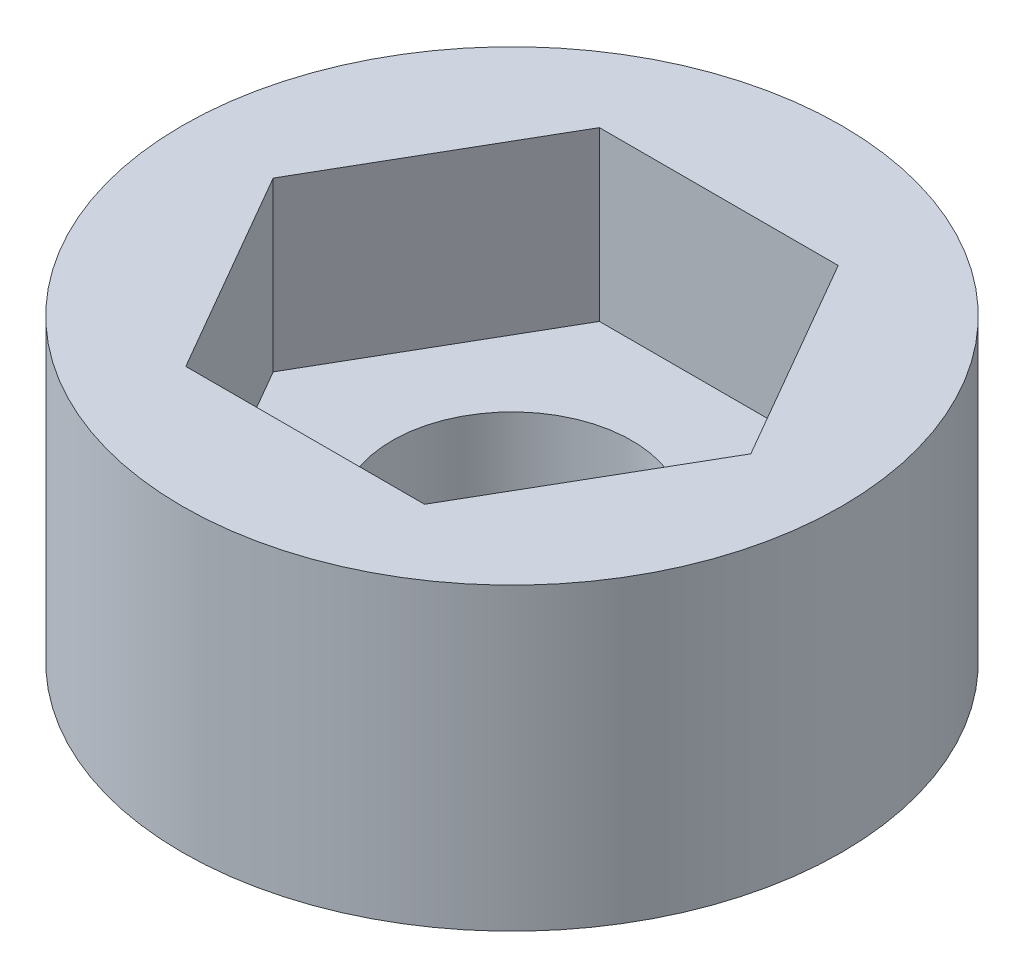
ISO-10303-21;
HEADER;
FILE_DESCRIPTION(('STEP AP214'),'2;1');
FILE_NAME('part.step','',(''),(''),'','','');
FILE_SCHEMA(('AUTOMOTIVE_DESIGN { 1 0 10303 214 1 1 1 1 }'));
ENDSEC;
DATA;
#1=APPLICATION_CONTEXT('core data for automotive mechanical design processes');
#2=APPLICATION_PROTOCOL_DEFINITION('international standard','automotive_design',2000,#1);
#3=PRODUCT_CONTEXT('',#1,'mechanical');
#4=PRODUCT('Part','Part','',(#3));
#5=PRODUCT_RELATED_PRODUCT_CATEGORY('part','',(#4));
#6=PRODUCT_DEFINITION_FORMATION('','',#4);
#7=PRODUCT_DEFINITION_CONTEXT('part definition',#1,'design');
#8=PRODUCT_DEFINITION('design','',#6,#7);
#9=PRODUCT_DEFINITION_SHAPE('','',#8);
#10=(LENGTH_UNIT() NAMED_UNIT(*) SI_UNIT(.MILLI.,.METRE.));
#11=(NAMED_UNIT(*) PLANE_ANGLE_UNIT() SI_UNIT($,.RADIAN.));
#12=(NAMED_UNIT(*) SI_UNIT($,.STERADIAN.) SOLID_ANGLE_UNIT());
#13=UNCERTAINTY_MEASURE_WITH_UNIT(LENGTH_MEASURE(1.E-05),#10,'distance_accuracy_value','');
#14=(GEOMETRIC_REPRESENTATION_CONTEXT(3) GLOBAL_UNCERTAINTY_ASSIGNED_CONTEXT((#13)) GLOBAL_UNIT_ASSIGNED_CONTEXT((#10,
#11,#12)) REPRESENTATION_CONTEXT('',''));
#15=CARTESIAN_POINT('',(0.,0.,0.));
#16=DIRECTION('',(0.,0.,1.));
#17=DIRECTION('',(1.,0.,0.));
#18=AXIS2_PLACEMENT_3D('',#15,#16,#17);
#19=CARTESIAN_POINT('',(0.,10.,0.));
#20=DIRECTION('',(0.,-1.,0.));
#21=DIRECTION('',(0.,0.,-1.));
#22=AXIS2_PLACEMENT_3D('',#19,#20,#21);
#23=CYLINDRICAL_SURFACE('',#22,4.);
#24=CARTESIAN_POINT('',(0.,0.,0.));
#25=DIRECTION('',(0.,1.,0.));
#26=DIRECTION('',(0.,0.,1.));
#27=AXIS2_PLACEMENT_3D('',#24,#25,#26);
#28=CIRCLE('',#27,4.);
#29=CARTESIAN_POINT('',(0.,0.,4.));
#30=VERTEX_POINT('',#29);
#31=EDGE_CURVE('E150',#30,#30,#28,.T.);
#32=ORIENTED_EDGE('',*,*,#31,.F.);
#33=EDGE_LOOP('',(#32));
#34=FACE_BOUND('',#33,.T.);
#35=CARTESIAN_POINT('',(0.,4.4,0.));
#36=DIRECTION('',(0.,1.,0.));
#37=DIRECTION('',(0.,0.,1.));
#38=AXIS2_PLACEMENT_3D('',#35,#36,#37);
#39=CIRCLE('',#38,4.);
#40=CARTESIAN_POINT('',(0.,4.4,4.));
#41=VERTEX_POINT('',#40);
#42=EDGE_CURVE('E45',#41,#41,#39,.T.);
#43=ORIENTED_EDGE('',*,*,#42,.T.);
#44=EDGE_LOOP('',(#43));
#45=FACE_BOUND('',#44,.T.);
#46=ADVANCED_FACE('F41',(#34,#45),#23,.F.);
#47=CARTESIAN_POINT('',(0.,10.,0.));
#48=DIRECTION('',(0.,1.,0.));
#49=DIRECTION('',(0.,0.,1.));
#50=AXIS2_PLACEMENT_3D('',#47,#48,#49);
#51=PLANE('',#50);
#52=DIRECTION('',(-0.5,0.,-0.866025403784439));
#53=VECTOR('',#52,1.);
#54=CARTESIAN_POINT('',(7.96743371481684,10.,0.));
#55=LINE('',#54,#53);
#56=CARTESIAN_POINT('',(7.96743371481684,10.,0.));
#57=VERTEX_POINT('',#56);
#58=CARTESIAN_POINT('',(3.98371685740842,10.,-6.9));
#59=VERTEX_POINT('',#58);
#60=EDGE_CURVE('E58',#57,#59,#55,.T.);
#61=ORIENTED_EDGE('',*,*,#60,.F.);
#62=DIRECTION('',(0.5,0.,-0.866025403784439));
#63=VECTOR('',#62,1.);
#64=CARTESIAN_POINT('',(3.98371685740842,10.,6.9));
#65=LINE('',#64,#63);
#66=CARTESIAN_POINT('',(3.98371685740842,10.,6.9));
#67=VERTEX_POINT('',#66);
#68=EDGE_CURVE('E141',#67,#57,#65,.T.);
#69=ORIENTED_EDGE('',*,*,#68,.F.);
#70=DIRECTION('',(1.,0.,0.));
#71=VECTOR('',#70,1.);
#72=CARTESIAN_POINT('',(-3.98371685740842,10.,6.9));
#73=LINE('',#72,#71);
#74=CARTESIAN_POINT('',(-3.98371685740842,10.,6.9));
#75=VERTEX_POINT('',#74);
#76=EDGE_CURVE('E139',#75,#67,#73,.T.);
#77=ORIENTED_EDGE('',*,*,#76,.F.);
#78=DIRECTION('',(0.5,0.,0.866025403784439));
#79=VECTOR('',#78,1.);
#80=CARTESIAN_POINT('',(-7.96743371481684,10.,0.));
#81=LINE('',#80,#79);
#82=CARTESIAN_POINT('',(-7.96743371481684,10.,0.));
#83=VERTEX_POINT('',#82);
#84=EDGE_CURVE('E106',#83,#75,#81,.T.);
#85=ORIENTED_EDGE('',*,*,#84,.F.);
#86=DIRECTION('',(-0.5,0.,0.866025403784439));
#87=VECTOR('',#86,1.);
#88=CARTESIAN_POINT('',(-3.98371685740842,10.,-6.9));
#89=LINE('',#88,#87);
#90=CARTESIAN_POINT('',(-3.98371685740842,10.,-6.9));
#91=VERTEX_POINT('',#90);
#92=EDGE_CURVE('E135',#91,#83,#89,.T.);
#93=ORIENTED_EDGE('',*,*,#92,.F.);
#94=DIRECTION('',(-1.,0.,0.));
#95=VECTOR('',#94,1.);
#96=CARTESIAN_POINT('',(3.98371685740842,10.,-6.9));
#97=LINE('',#96,#95);
#98=EDGE_CURVE('E132',#59,#91,#97,.T.);
#99=ORIENTED_EDGE('',*,*,#98,.F.);
#100=EDGE_LOOP('',(#61,#69,#77,#85,#93,#99));
#101=FACE_BOUND('',#100,.T.);
#102=CARTESIAN_POINT('',(0.,10.,0.));
#103=DIRECTION('',(0.,1.,0.));
#104=DIRECTION('',(0.,0.,1.));
#105=AXIS2_PLACEMENT_3D('',#102,#103,#104);
#106=CIRCLE('',#105,11.);
#107=CARTESIAN_POINT('',(0.,10.,11.));
#108=VERTEX_POINT('',#107);
#109=EDGE_CURVE('E11',#108,#108,#106,.T.);
#110=ORIENTED_EDGE('',*,*,#109,.T.);
#111=EDGE_LOOP('',(#110));
#112=FACE_BOUND('',#111,.T.);
#113=ADVANCED_FACE('F159',(#101,#112),#51,.T.);
#114=CARTESIAN_POINT('',(0.,0.,0.));
#115=DIRECTION('',(0.,1.,0.));
#116=DIRECTION('',(0.,0.,1.));
#117=AXIS2_PLACEMENT_3D('',#114,#115,#116);
#118=PLANE('',#117);
#119=CARTESIAN_POINT('',(0.,0.,0.));
#120=DIRECTION('',(0.,1.,0.));
#121=DIRECTION('',(0.,0.,1.));
#122=AXIS2_PLACEMENT_3D('',#119,#120,#121);
#123=CIRCLE('',#122,11.);
#124=CARTESIAN_POINT('',(0.,0.,11.));
#125=VERTEX_POINT('',#124);
#126=EDGE_CURVE('E50',#125,#125,#123,.T.);
#127=ORIENTED_EDGE('',*,*,#126,.F.);
#128=EDGE_LOOP('',(#127));
#129=FACE_BOUND('',#128,.T.);
#130=ORIENTED_EDGE('',*,*,#31,.T.);
#131=EDGE_LOOP('',(#130));
#132=FACE_BOUND('',#131,.T.);
#133=ADVANCED_FACE('F156',(#129,#132),#118,.F.);
#134=CARTESIAN_POINT('',(0.,10.,0.));
#135=DIRECTION('',(0.,-1.,0.));
#136=DIRECTION('',(0.,0.,-1.));
#137=AXIS2_PLACEMENT_3D('',#134,#135,#136);
#138=CYLINDRICAL_SURFACE('',#137,11.);
#139=ORIENTED_EDGE('',*,*,#109,.F.);
#140=EDGE_LOOP('',(#139));
#141=FACE_BOUND('',#140,.T.);
#142=ORIENTED_EDGE('',*,*,#126,.T.);
#143=EDGE_LOOP('',(#142));
#144=FACE_BOUND('',#143,.T.);
#145=ADVANCED_FACE('F43',(#141,#144),#138,.T.);
#146=CARTESIAN_POINT('',(7.96743371481684,4.4,0.));
#147=DIRECTION('',(0.866025403784439,0.,-0.5));
#148=DIRECTION('',(-0.5,0.,-0.866025403784439));
#149=AXIS2_PLACEMENT_3D('',#146,#147,#148);
#150=PLANE('',#149);
#151=ORIENTED_EDGE('',*,*,#60,.T.);
#152=DIRECTION('',(0.,1.,0.));
#153=VECTOR('',#152,1.);
#154=CARTESIAN_POINT('',(3.98371685740842,4.4,-6.9));
#155=LINE('',#154,#153);
#156=CARTESIAN_POINT('',(3.98371685740842,4.4,-6.9));
#157=VERTEX_POINT('',#156);
#158=EDGE_CURVE('E88',#157,#59,#155,.T.);
#159=ORIENTED_EDGE('',*,*,#158,.F.);
#160=DIRECTION('',(-0.5,0.,-0.866025403784439));
#161=VECTOR('',#160,1.);
#162=CARTESIAN_POINT('',(7.96743371481684,4.4,0.));
#163=LINE('',#162,#161);
#164=CARTESIAN_POINT('',(7.96743371481684,4.4,0.));
#165=VERTEX_POINT('',#164);
#166=EDGE_CURVE('E143',#165,#157,#163,.T.);
#167=ORIENTED_EDGE('',*,*,#166,.F.);
#168=DIRECTION('',(0.,1.,0.));
#169=VECTOR('',#168,1.);
#170=CARTESIAN_POINT('',(7.96743371481684,4.4,0.));
#171=LINE('',#170,#169);
#172=EDGE_CURVE('E66',#165,#57,#171,.T.);
#173=ORIENTED_EDGE('',*,*,#172,.T.);
#174=EDGE_LOOP('',(#151,#159,#167,#173));
#175=FACE_BOUND('',#174,.T.);
#176=ADVANCED_FACE('F181',(#175),#150,.F.);
#177=CARTESIAN_POINT('',(3.98371685740842,4.4,6.9));
#178=DIRECTION('',(0.866025403784438,0.,0.5));
#179=DIRECTION('',(0.5,0.,-0.866025403784439));
#180=AXIS2_PLACEMENT_3D('',#177,#178,#179);
#181=PLANE('',#180);
#182=ORIENTED_EDGE('',*,*,#68,.T.);
#183=ORIENTED_EDGE('',*,*,#172,.F.);
#184=DIRECTION('',(0.5,0.,-0.866025403784439));
#185=VECTOR('',#184,1.);
#186=CARTESIAN_POINT('',(3.98371685740842,4.4,6.9));
#187=LINE('',#186,#185);
#188=CARTESIAN_POINT('',(3.98371685740842,4.4,6.9));
#189=VERTEX_POINT('',#188);
#190=EDGE_CURVE('E118',#189,#165,#187,.T.);
#191=ORIENTED_EDGE('',*,*,#190,.F.);
#192=DIRECTION('',(0.,1.,0.));
#193=VECTOR('',#192,1.);
#194=CARTESIAN_POINT('',(3.98371685740842,4.4,6.9));
#195=LINE('',#194,#193);
#196=EDGE_CURVE('E110',#189,#67,#195,.T.);
#197=ORIENTED_EDGE('',*,*,#196,.T.);
#198=EDGE_LOOP('',(#182,#183,#191,#197));
#199=FACE_BOUND('',#198,.T.);
#200=ADVANCED_FACE('F178',(#199),#181,.F.);
#201=CARTESIAN_POINT('',(-3.98371685740842,4.4,6.9));
#202=DIRECTION('',(0.,0.,1.));
#203=DIRECTION('',(1.,0.,0.));
#204=AXIS2_PLACEMENT_3D('',#201,#202,#203);
#205=PLANE('',#204);
#206=ORIENTED_EDGE('',*,*,#76,.T.);
#207=ORIENTED_EDGE('',*,*,#196,.F.);
#208=DIRECTION('',(1.,0.,0.));
#209=VECTOR('',#208,1.);
#210=CARTESIAN_POINT('',(-3.98371685740842,4.4,6.9));
#211=LINE('',#210,#209);
#212=CARTESIAN_POINT('',(-3.98371685740842,4.4,6.9));
#213=VERTEX_POINT('',#212);
#214=EDGE_CURVE('E114',#213,#189,#211,.T.);
#215=ORIENTED_EDGE('',*,*,#214,.F.);
#216=DIRECTION('',(0.,1.,0.));
#217=VECTOR('',#216,1.);
#218=CARTESIAN_POINT('',(-3.98371685740842,4.4,6.9));
#219=LINE('',#218,#217);
#220=EDGE_CURVE('E99',#213,#75,#219,.T.);
#221=ORIENTED_EDGE('',*,*,#220,.T.);
#222=EDGE_LOOP('',(#206,#207,#215,#221));
#223=FACE_BOUND('',#222,.T.);
#224=ADVANCED_FACE('F115',(#223),#205,.F.);
#225=CARTESIAN_POINT('',(-7.96743371481684,4.4,0.));
#226=DIRECTION('',(-0.866025403784439,0.,0.5));
#227=DIRECTION('',(0.5,0.,0.866025403784439));
#228=AXIS2_PLACEMENT_3D('',#225,#226,#227);
#229=PLANE('',#228);
#230=ORIENTED_EDGE('',*,*,#84,.T.);
#231=ORIENTED_EDGE('',*,*,#220,.F.);
#232=DIRECTION('',(0.5,0.,0.866025403784439));
#233=VECTOR('',#232,1.);
#234=CARTESIAN_POINT('',(-7.96743371481684,4.4,0.));
#235=LINE('',#234,#233);
#236=CARTESIAN_POINT('',(-7.96743371481684,4.4,0.));
#237=VERTEX_POINT('',#236);
#238=EDGE_CURVE('E103',#237,#213,#235,.T.);
#239=ORIENTED_EDGE('',*,*,#238,.F.);
#240=DIRECTION('',(0.,1.,0.));
#241=VECTOR('',#240,1.);
#242=CARTESIAN_POINT('',(-7.96743371481684,4.4,0.));
#243=LINE('',#242,#241);
#244=EDGE_CURVE('E111',#237,#83,#243,.T.);
#245=ORIENTED_EDGE('',*,*,#244,.T.);
#246=EDGE_LOOP('',(#230,#231,#239,#245));
#247=FACE_BOUND('',#246,.T.);
#248=ADVANCED_FACE('F101',(#247),#229,.F.);
#249=CARTESIAN_POINT('',(-3.98371685740842,4.4,-6.9));
#250=DIRECTION('',(-0.866025403784439,0.,-0.5));
#251=DIRECTION('',(-0.5,0.,0.866025403784439));
#252=AXIS2_PLACEMENT_3D('',#249,#250,#251);
#253=PLANE('',#252);
#254=ORIENTED_EDGE('',*,*,#92,.T.);
#255=ORIENTED_EDGE('',*,*,#244,.F.);
#256=DIRECTION('',(-0.5,0.,0.866025403784439));
#257=VECTOR('',#256,1.);
#258=CARTESIAN_POINT('',(-3.98371685740842,4.4,-6.9));
#259=LINE('',#258,#257);
#260=CARTESIAN_POINT('',(-3.98371685740842,4.4,-6.9));
#261=VERTEX_POINT('',#260);
#262=EDGE_CURVE('E124',#261,#237,#259,.T.);
#263=ORIENTED_EDGE('',*,*,#262,.F.);
#264=DIRECTION('',(0.,1.,0.));
#265=VECTOR('',#264,1.);
#266=CARTESIAN_POINT('',(-3.98371685740842,4.4,-6.9));
#267=LINE('',#266,#265);
#268=EDGE_CURVE('E147',#261,#91,#267,.T.);
#269=ORIENTED_EDGE('',*,*,#268,.T.);
#270=EDGE_LOOP('',(#254,#255,#263,#269));
#271=FACE_BOUND('',#270,.T.);
#272=ADVANCED_FACE('F174',(#271),#253,.F.);
#273=CARTESIAN_POINT('',(3.98371685740842,4.4,-6.9));
#274=DIRECTION('',(0.,0.,-1.));
#275=DIRECTION('',(-1.,0.,0.));
#276=AXIS2_PLACEMENT_3D('',#273,#274,#275);
#277=PLANE('',#276);
#278=ORIENTED_EDGE('',*,*,#98,.T.);
#279=ORIENTED_EDGE('',*,*,#268,.F.);
#280=DIRECTION('',(-1.,0.,0.));
#281=VECTOR('',#280,1.);
#282=CARTESIAN_POINT('',(3.98371685740842,4.4,-6.9));
#283=LINE('',#282,#281);
#284=EDGE_CURVE('E126',#157,#261,#283,.T.);
#285=ORIENTED_EDGE('',*,*,#284,.F.);
#286=ORIENTED_EDGE('',*,*,#158,.T.);
#287=EDGE_LOOP('',(#278,#279,#285,#286));
#288=FACE_BOUND('',#287,.T.);
#289=ADVANCED_FACE('F169',(#288),#277,.F.);
#290=CARTESIAN_POINT('',(0.,4.4,0.));
#291=DIRECTION('',(0.,1.,0.));
#292=DIRECTION('',(0.,0.,1.));
#293=AXIS2_PLACEMENT_3D('',#290,#291,#292);
#294=PLANE('',#293);
#295=ORIENTED_EDGE('',*,*,#42,.F.);
#296=EDGE_LOOP('',(#295));
#297=FACE_BOUND('',#296,.T.);
#298=ORIENTED_EDGE('',*,*,#166,.T.);
#299=ORIENTED_EDGE('',*,*,#284,.T.);
#300=ORIENTED_EDGE('',*,*,#262,.T.);
#301=ORIENTED_EDGE('',*,*,#238,.T.);
#302=ORIENTED_EDGE('',*,*,#214,.T.);
#303=ORIENTED_EDGE('',*,*,#190,.T.);
#304=EDGE_LOOP('',(#298,#299,#300,#301,#302,#303));
#305=FACE_BOUND('',#304,.T.);
#306=ADVANCED_FACE('F121',(#297,#305),#294,.T.);
#307=CLOSED_SHELL('',(#46,#113,#133,#145,#176,#200,#224,#248,#272,#289,#306));
#308=MANIFOLD_SOLID_BREP('B2',#307);
#309=ADVANCED_BREP_SHAPE_REPRESENTATION('',(#18,#308),#14);
#310=SHAPE_DEFINITION_REPRESENTATION(#9,#309);
ENDSEC;
END-ISO-10303-21;
